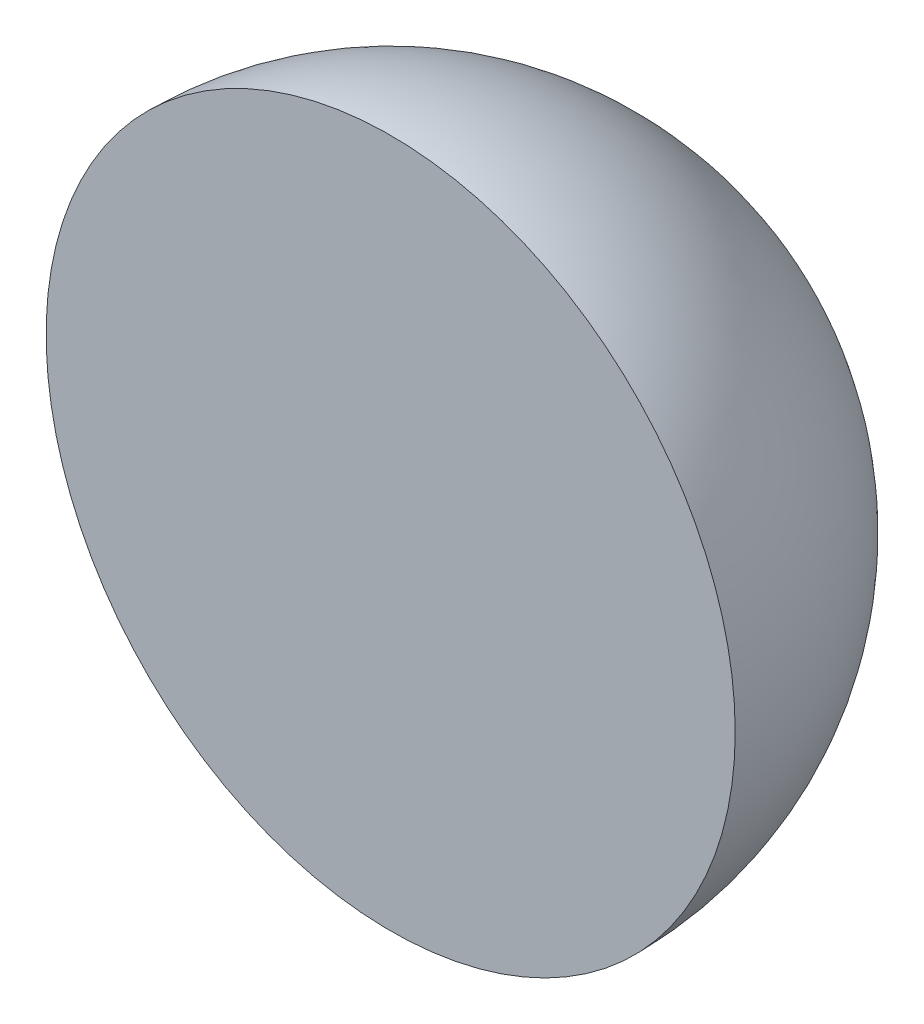
ISO-10303-21;
HEADER;
FILE_DESCRIPTION(('STEP AP214'),'2;1');
FILE_NAME('part.step','',(''),(''),'','','');
FILE_SCHEMA(('AUTOMOTIVE_DESIGN { 1 0 10303 214 1 1 1 1 }'));
ENDSEC;
DATA;
#1=APPLICATION_CONTEXT('core data for automotive mechanical design processes');
#2=APPLICATION_PROTOCOL_DEFINITION('international standard','automotive_design',2000,#1);
#3=PRODUCT_CONTEXT('',#1,'mechanical');
#4=PRODUCT('Part','Part','',(#3));
#5=PRODUCT_RELATED_PRODUCT_CATEGORY('part','',(#4));
#6=PRODUCT_DEFINITION_FORMATION('','',#4);
#7=PRODUCT_DEFINITION_CONTEXT('part definition',#1,'design');
#8=PRODUCT_DEFINITION('design','',#6,#7);
#9=PRODUCT_DEFINITION_SHAPE('','',#8);
#10=(LENGTH_UNIT() NAMED_UNIT(*) SI_UNIT(.MILLI.,.METRE.));
#11=(NAMED_UNIT(*) PLANE_ANGLE_UNIT() SI_UNIT($,.RADIAN.));
#12=(NAMED_UNIT(*) SI_UNIT($,.STERADIAN.) SOLID_ANGLE_UNIT());
#13=UNCERTAINTY_MEASURE_WITH_UNIT(LENGTH_MEASURE(1.E-05),#10,'distance_accuracy_value','');
#14=(GEOMETRIC_REPRESENTATION_CONTEXT(3) GLOBAL_UNCERTAINTY_ASSIGNED_CONTEXT((#13)) GLOBAL_UNIT_ASSIGNED_CONTEXT((#10,
#11,#12)) REPRESENTATION_CONTEXT('',''));
#15=CARTESIAN_POINT('',(0.,0.,0.));
#16=DIRECTION('',(0.,0.,1.));
#17=DIRECTION('',(1.,0.,0.));
#18=AXIS2_PLACEMENT_3D('',#15,#16,#17);
#19=CARTESIAN_POINT('',(0.,0.,1.5));
#20=DIRECTION('',(0.,-1.,0.));
#21=DIRECTION('',(-1.,0.,0.));
#22=AXIS2_PLACEMENT_3D('',#19,#20,#21);
#23=SPHERICAL_SURFACE('',#22,1.5);
#24=CARTESIAN_POINT('',(0.,0.,1.5));
#25=DIRECTION('',(0.,0.,-1.));
#26=DIRECTION('',(1.,0.,0.));
#27=AXIS2_PLACEMENT_3D('',#24,#25,#26);
#28=SPHERICAL_SURFACE('',#27,1.5);
#29=CARTESIAN_POINT('',(0.,0.,1.5));
#30=DIRECTION('',(0.,0.,-1.));
#31=DIRECTION('',(1.,0.,0.));
#32=AXIS2_PLACEMENT_3D('',#29,#30,#31);
#33=CIRCLE('',#32,1.5);
#34=CARTESIAN_POINT('',(1.5,0.,1.49999999999999));
#35=VERTEX_POINT('',#34);
#36=EDGE_CURVE('E10',#35,#35,#33,.T.);
#37=ORIENTED_EDGE('',*,*,#36,.T.);
#38=EDGE_LOOP('',(#37));
#39=FACE_BOUND('',#38,.T.);
#40=ADVANCED_FACE('F30',(#39),#28,.T.);
#41=CARTESIAN_POINT('',(0.,0.,1.5));
#42=DIRECTION('',(0.,0.,1.));
#43=DIRECTION('',(1.,0.,0.));
#44=AXIS2_PLACEMENT_3D('',#41,#42,#43);
#45=PLANE('',#44);
#46=ORIENTED_EDGE('',*,*,#36,.F.);
#47=EDGE_LOOP('',(#46));
#48=FACE_BOUND('',#47,.T.);
#49=ADVANCED_FACE('F38',(#48),#45,.T.);
#50=CLOSED_SHELL('',(#40,#49));
#51=MANIFOLD_SOLID_BREP('B2',#50);
#52=ADVANCED_BREP_SHAPE_REPRESENTATION('',(#18,#51),#14);
#53=SHAPE_DEFINITION_REPRESENTATION(#9,#52);
ENDSEC;
END-ISO-10303-21;
